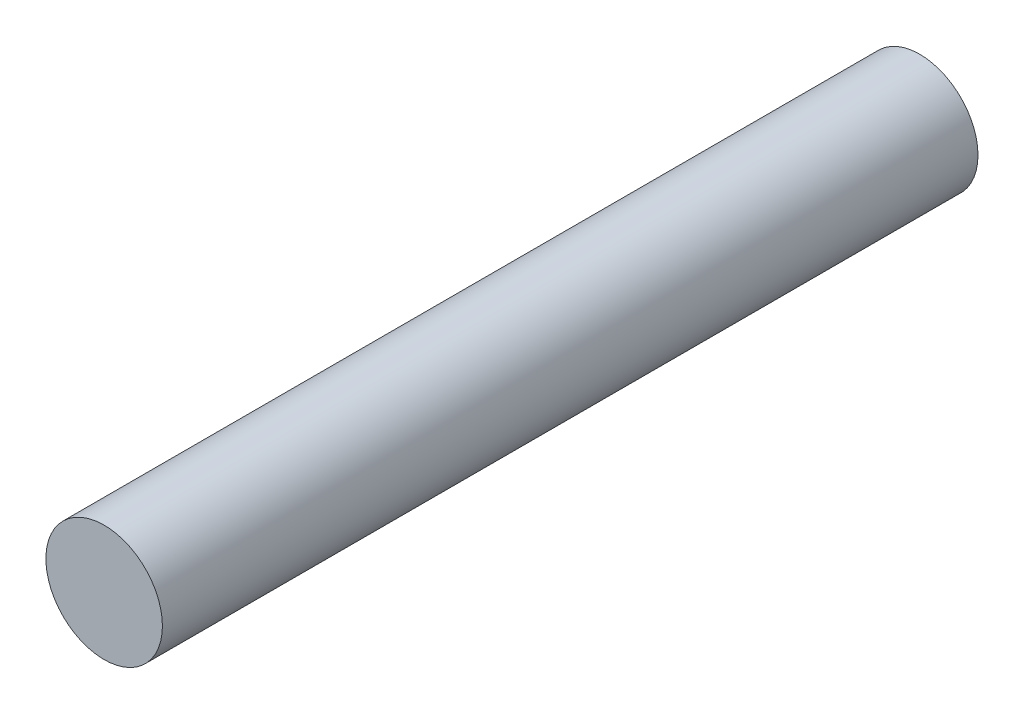
ISO-10303-21;
HEADER;
FILE_DESCRIPTION(('STEP AP214'),'2;1');
FILE_NAME('part.step','',(''),(''),'','','');
FILE_SCHEMA(('AUTOMOTIVE_DESIGN { 1 0 10303 214 1 1 1 1 }'));
ENDSEC;
DATA;
#1=APPLICATION_CONTEXT('core data for automotive mechanical design processes');
#2=APPLICATION_PROTOCOL_DEFINITION('international standard','automotive_design',2000,#1);
#3=PRODUCT_CONTEXT('',#1,'mechanical');
#4=PRODUCT('Part','Part','',(#3));
#5=PRODUCT_RELATED_PRODUCT_CATEGORY('part','',(#4));
#6=PRODUCT_DEFINITION_FORMATION('','',#4);
#7=PRODUCT_DEFINITION_CONTEXT('part definition',#1,'design');
#8=PRODUCT_DEFINITION('design','',#6,#7);
#9=PRODUCT_DEFINITION_SHAPE('','',#8);
#10=(LENGTH_UNIT() NAMED_UNIT(*) SI_UNIT(.MILLI.,.METRE.));
#11=(NAMED_UNIT(*) PLANE_ANGLE_UNIT() SI_UNIT($,.RADIAN.));
#12=(NAMED_UNIT(*) SI_UNIT($,.STERADIAN.) SOLID_ANGLE_UNIT());
#13=UNCERTAINTY_MEASURE_WITH_UNIT(LENGTH_MEASURE(1.E-05),#10,'distance_accuracy_value','');
#14=(GEOMETRIC_REPRESENTATION_CONTEXT(3) GLOBAL_UNCERTAINTY_ASSIGNED_CONTEXT((#13)) GLOBAL_UNIT_ASSIGNED_CONTEXT((#10,
#11,#12)) REPRESENTATION_CONTEXT('',''));
#15=CARTESIAN_POINT('',(0.,0.,0.));
#16=DIRECTION('',(0.,0.,1.));
#17=DIRECTION('',(1.,0.,0.));
#18=AXIS2_PLACEMENT_3D('',#15,#16,#17);
#19=CARTESIAN_POINT('',(0.,0.,28.));
#20=DIRECTION('',(0.,0.,-1.));
#21=DIRECTION('',(-1.,0.,0.));
#22=AXIS2_PLACEMENT_3D('',#19,#20,#21);
#23=CYLINDRICAL_SURFACE('',#22,2.);
#24=CARTESIAN_POINT('',(0.,0.,28.));
#25=DIRECTION('',(0.,0.,1.));
#26=DIRECTION('',(1.,0.,0.));
#27=AXIS2_PLACEMENT_3D('',#24,#25,#26);
#28=CIRCLE('',#27,2.);
#29=CARTESIAN_POINT('',(2.,0.,28.));
#30=VERTEX_POINT('',#29);
#31=EDGE_CURVE('E10',#30,#30,#28,.T.);
#32=ORIENTED_EDGE('',*,*,#31,.F.);
#33=EDGE_LOOP('',(#32));
#34=FACE_BOUND('',#33,.T.);
#35=CARTESIAN_POINT('',(0.,0.,0.));
#36=DIRECTION('',(0.,0.,1.));
#37=DIRECTION('',(1.,0.,0.));
#38=AXIS2_PLACEMENT_3D('',#35,#36,#37);
#39=CIRCLE('',#38,2.);
#40=CARTESIAN_POINT('',(2.,0.,0.));
#41=VERTEX_POINT('',#40);
#42=EDGE_CURVE('E45',#41,#41,#39,.T.);
#43=ORIENTED_EDGE('',*,*,#42,.T.);
#44=EDGE_LOOP('',(#43));
#45=FACE_BOUND('',#44,.T.);
#46=ADVANCED_FACE('F39',(#34,#45),#23,.T.);
#47=CARTESIAN_POINT('',(0.,0.,28.));
#48=DIRECTION('',(0.,0.,1.));
#49=DIRECTION('',(1.,0.,0.));
#50=AXIS2_PLACEMENT_3D('',#47,#48,#49);
#51=PLANE('',#50);
#52=ORIENTED_EDGE('',*,*,#31,.T.);
#53=EDGE_LOOP('',(#52));
#54=FACE_BOUND('',#53,.T.);
#55=ADVANCED_FACE('F53',(#54),#51,.T.);
#56=CARTESIAN_POINT('',(0.,0.,0.));
#57=DIRECTION('',(0.,0.,1.));
#58=DIRECTION('',(1.,0.,0.));
#59=AXIS2_PLACEMENT_3D('',#56,#57,#58);
#60=PLANE('',#59);
#61=ORIENTED_EDGE('',*,*,#42,.F.);
#62=EDGE_LOOP('',(#61));
#63=FACE_BOUND('',#62,.T.);
#64=ADVANCED_FACE('F55',(#63),#60,.F.);
#65=CLOSED_SHELL('',(#46,#55,#64));
#66=MANIFOLD_SOLID_BREP('B2',#65);
#67=ADVANCED_BREP_SHAPE_REPRESENTATION('',(#18,#66),#14);
#68=SHAPE_DEFINITION_REPRESENTATION(#9,#67);
ENDSEC;
END-ISO-10303-21;
